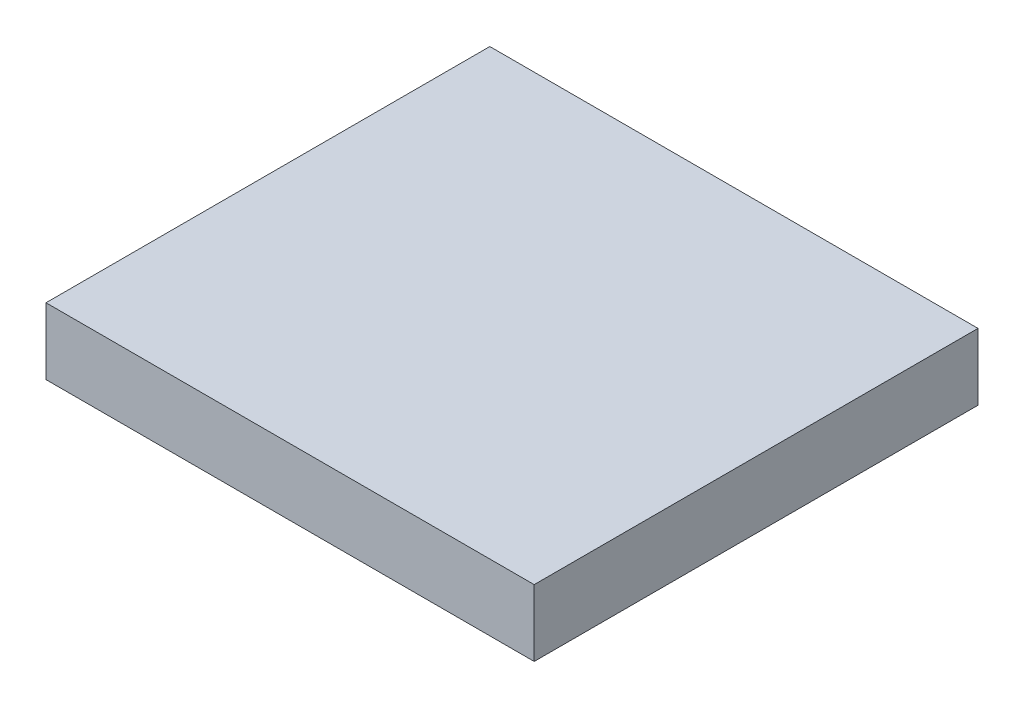
ISO-10303-21;
HEADER;
FILE_DESCRIPTION(('STEP AP214'),'2;1');
FILE_NAME('part.step','',(''),(''),'','','');
FILE_SCHEMA(('AUTOMOTIVE_DESIGN { 1 0 10303 214 1 1 1 1 }'));
ENDSEC;
DATA;
#1=APPLICATION_CONTEXT('core data for automotive mechanical design processes');
#2=APPLICATION_PROTOCOL_DEFINITION('international standard','automotive_design',2000,#1);
#3=PRODUCT_CONTEXT('',#1,'mechanical');
#4=PRODUCT('Part','Part','',(#3));
#5=PRODUCT_RELATED_PRODUCT_CATEGORY('part','',(#4));
#6=PRODUCT_DEFINITION_FORMATION('','',#4);
#7=PRODUCT_DEFINITION_CONTEXT('part definition',#1,'design');
#8=PRODUCT_DEFINITION('design','',#6,#7);
#9=PRODUCT_DEFINITION_SHAPE('','',#8);
#10=(LENGTH_UNIT() NAMED_UNIT(*) SI_UNIT(.MILLI.,.METRE.));
#11=(NAMED_UNIT(*) PLANE_ANGLE_UNIT() SI_UNIT($,.RADIAN.));
#12=(NAMED_UNIT(*) SI_UNIT($,.STERADIAN.) SOLID_ANGLE_UNIT());
#13=UNCERTAINTY_MEASURE_WITH_UNIT(LENGTH_MEASURE(1.E-05),#10,'distance_accuracy_value','');
#14=(GEOMETRIC_REPRESENTATION_CONTEXT(3) GLOBAL_UNCERTAINTY_ASSIGNED_CONTEXT((#13)) GLOBAL_UNIT_ASSIGNED_CONTEXT((#10,
#11,#12)) REPRESENTATION_CONTEXT('',''));
#15=CARTESIAN_POINT('',(0.,0.,0.));
#16=DIRECTION('',(0.,0.,1.));
#17=DIRECTION('',(1.,0.,0.));
#18=AXIS2_PLACEMENT_3D('',#15,#16,#17);
#19=CARTESIAN_POINT('',(-35.,-6.,-20.));
#20=DIRECTION('',(0.,0.,-1.));
#21=DIRECTION('',(-1.,0.,0.));
#22=AXIS2_PLACEMENT_3D('',#19,#20,#21);
#23=PLANE('',#22);
#24=DIRECTION('',(-1.,0.,0.));
#25=VECTOR('',#24,1.);
#26=CARTESIAN_POINT('',(-35.,0.,-20.));
#27=LINE('',#26,#25);
#28=CARTESIAN_POINT('',(-35.,0.,-20.));
#29=VERTEX_POINT('',#28);
#30=CARTESIAN_POINT('',(-79.,0.,-20.));
#31=VERTEX_POINT('',#30);
#32=EDGE_CURVE('E109',#29,#31,#27,.T.);
#33=ORIENTED_EDGE('',*,*,#32,.F.);
#34=DIRECTION('',(0.,1.,0.));
#35=VECTOR('',#34,1.);
#36=CARTESIAN_POINT('',(-35.,-6.,-20.));
#37=LINE('',#36,#35);
#38=CARTESIAN_POINT('',(-35.,-6.,-20.));
#39=VERTEX_POINT('',#38);
#40=EDGE_CURVE('E11',#39,#29,#37,.T.);
#41=ORIENTED_EDGE('',*,*,#40,.F.);
#42=DIRECTION('',(-1.,0.,0.));
#43=VECTOR('',#42,1.);
#44=CARTESIAN_POINT('',(-35.,-6.,-20.));
#45=LINE('',#44,#43);
#46=CARTESIAN_POINT('',(-79.,-6.,-20.));
#47=VERTEX_POINT('',#46);
#48=EDGE_CURVE('E101',#39,#47,#45,.T.);
#49=ORIENTED_EDGE('',*,*,#48,.T.);
#50=DIRECTION('',(0.,1.,0.));
#51=VECTOR('',#50,1.);
#52=CARTESIAN_POINT('',(-79.,-6.,-20.));
#53=LINE('',#52,#51);
#54=EDGE_CURVE('E42',#47,#31,#53,.T.);
#55=ORIENTED_EDGE('',*,*,#54,.T.);
#56=EDGE_LOOP('',(#33,#41,#49,#55));
#57=FACE_BOUND('',#56,.T.);
#58=ADVANCED_FACE('F39',(#57),#23,.T.);
#59=CARTESIAN_POINT('',(-35.,-6.,-20.));
#60=DIRECTION('',(1.,0.,0.));
#61=DIRECTION('',(0.,0.,-1.));
#62=AXIS2_PLACEMENT_3D('',#59,#60,#61);
#63=PLANE('',#62);
#64=DIRECTION('',(0.,0.,-1.));
#65=VECTOR('',#64,1.);
#66=CARTESIAN_POINT('',(-35.,0.,-20.));
#67=LINE('',#66,#65);
#68=CARTESIAN_POINT('',(-35.,0.,20.));
#69=VERTEX_POINT('',#68);
#70=EDGE_CURVE('E104',#69,#29,#67,.T.);
#71=ORIENTED_EDGE('',*,*,#70,.F.);
#72=DIRECTION('',(0.,1.,0.));
#73=VECTOR('',#72,1.);
#74=CARTESIAN_POINT('',(-35.,-6.,20.));
#75=LINE('',#74,#73);
#76=CARTESIAN_POINT('',(-35.,-6.,20.));
#77=VERTEX_POINT('',#76);
#78=EDGE_CURVE('E49',#77,#69,#75,.T.);
#79=ORIENTED_EDGE('',*,*,#78,.F.);
#80=DIRECTION('',(0.,0.,-1.));
#81=VECTOR('',#80,1.);
#82=CARTESIAN_POINT('',(-35.,-6.,-20.));
#83=LINE('',#82,#81);
#84=EDGE_CURVE('E96',#77,#39,#83,.T.);
#85=ORIENTED_EDGE('',*,*,#84,.T.);
#86=ORIENTED_EDGE('',*,*,#40,.T.);
#87=EDGE_LOOP('',(#71,#79,#85,#86));
#88=FACE_BOUND('',#87,.T.);
#89=ADVANCED_FACE('F125',(#88),#63,.T.);
#90=CARTESIAN_POINT('',(-35.,-6.,20.));
#91=DIRECTION('',(0.,0.,1.));
#92=DIRECTION('',(1.,0.,0.));
#93=AXIS2_PLACEMENT_3D('',#90,#91,#92);
#94=PLANE('',#93);
#95=DIRECTION('',(1.,0.,0.));
#96=VECTOR('',#95,1.);
#97=CARTESIAN_POINT('',(-35.,0.,20.));
#98=LINE('',#97,#96);
#99=CARTESIAN_POINT('',(-79.,0.,20.));
#100=VERTEX_POINT('',#99);
#101=EDGE_CURVE('E90',#100,#69,#98,.T.);
#102=ORIENTED_EDGE('',*,*,#101,.F.);
#103=DIRECTION('',(0.,1.,0.));
#104=VECTOR('',#103,1.);
#105=CARTESIAN_POINT('',(-79.,-6.,20.));
#106=LINE('',#105,#104);
#107=CARTESIAN_POINT('',(-79.,-6.,20.));
#108=VERTEX_POINT('',#107);
#109=EDGE_CURVE('E85',#108,#100,#106,.T.);
#110=ORIENTED_EDGE('',*,*,#109,.F.);
#111=DIRECTION('',(1.,0.,0.));
#112=VECTOR('',#111,1.);
#113=CARTESIAN_POINT('',(-35.,-6.,20.));
#114=LINE('',#113,#112);
#115=EDGE_CURVE('E88',#108,#77,#114,.T.);
#116=ORIENTED_EDGE('',*,*,#115,.T.);
#117=ORIENTED_EDGE('',*,*,#78,.T.);
#118=EDGE_LOOP('',(#102,#110,#116,#117));
#119=FACE_BOUND('',#118,.T.);
#120=ADVANCED_FACE('F87',(#119),#94,.T.);
#121=CARTESIAN_POINT('',(-79.,-6.,-20.));
#122=DIRECTION('',(-1.,0.,0.));
#123=DIRECTION('',(0.,0.,1.));
#124=AXIS2_PLACEMENT_3D('',#121,#122,#123);
#125=PLANE('',#124);
#126=DIRECTION('',(0.,0.,1.));
#127=VECTOR('',#126,1.);
#128=CARTESIAN_POINT('',(-79.,0.,-20.));
#129=LINE('',#128,#127);
#130=EDGE_CURVE('E113',#31,#100,#129,.T.);
#131=ORIENTED_EDGE('',*,*,#130,.F.);
#132=ORIENTED_EDGE('',*,*,#54,.F.);
#133=DIRECTION('',(0.,0.,1.));
#134=VECTOR('',#133,1.);
#135=CARTESIAN_POINT('',(-79.,-6.,-20.));
#136=LINE('',#135,#134);
#137=EDGE_CURVE('E95',#47,#108,#136,.T.);
#138=ORIENTED_EDGE('',*,*,#137,.T.);
#139=ORIENTED_EDGE('',*,*,#109,.T.);
#140=EDGE_LOOP('',(#131,#132,#138,#139));
#141=FACE_BOUND('',#140,.T.);
#142=ADVANCED_FACE('F99',(#141),#125,.T.);
#143=CARTESIAN_POINT('',(0.,-6.,0.));
#144=DIRECTION('',(0.,1.,0.));
#145=DIRECTION('',(0.,0.,1.));
#146=AXIS2_PLACEMENT_3D('',#143,#144,#145);
#147=PLANE('',#146);
#148=ORIENTED_EDGE('',*,*,#48,.F.);
#149=ORIENTED_EDGE('',*,*,#84,.F.);
#150=ORIENTED_EDGE('',*,*,#115,.F.);
#151=ORIENTED_EDGE('',*,*,#137,.F.);
#152=EDGE_LOOP('',(#148,#149,#150,#151));
#153=FACE_BOUND('',#152,.T.);
#154=ADVANCED_FACE('F94',(#153),#147,.F.);
#155=CARTESIAN_POINT('',(0.,0.,0.));
#156=DIRECTION('',(0.,1.,0.));
#157=DIRECTION('',(0.,0.,1.));
#158=AXIS2_PLACEMENT_3D('',#155,#156,#157);
#159=PLANE('',#158);
#160=ORIENTED_EDGE('',*,*,#32,.T.);
#161=ORIENTED_EDGE('',*,*,#130,.T.);
#162=ORIENTED_EDGE('',*,*,#101,.T.);
#163=ORIENTED_EDGE('',*,*,#70,.T.);
#164=EDGE_LOOP('',(#160,#161,#162,#163));
#165=FACE_BOUND('',#164,.T.);
#166=ADVANCED_FACE('F124',(#165),#159,.T.);
#167=CLOSED_SHELL('',(#58,#89,#120,#142,#154,#166));
#168=MANIFOLD_SOLID_BREP('B2',#167);
#169=ADVANCED_BREP_SHAPE_REPRESENTATION('',(#18,#168),#14);
#170=SHAPE_DEFINITION_REPRESENTATION(#9,#169);
ENDSEC;
END-ISO-10303-21;
